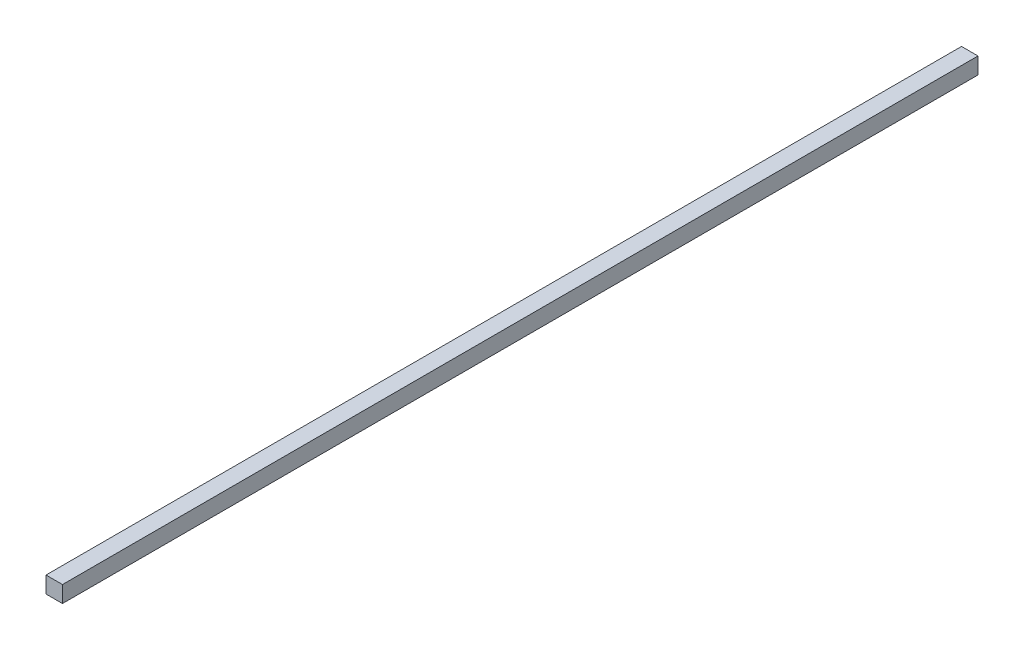
ISO-10303-21;
HEADER;
FILE_DESCRIPTION(('STEP AP214'),'2;1');
FILE_NAME('part.step','',(''),(''),'','','');
FILE_SCHEMA(('AUTOMOTIVE_DESIGN { 1 0 10303 214 1 1 1 1 }'));
ENDSEC;
DATA;
#1=APPLICATION_CONTEXT('core data for automotive mechanical design processes');
#2=APPLICATION_PROTOCOL_DEFINITION('international standard','automotive_design',2000,#1);
#3=PRODUCT_CONTEXT('',#1,'mechanical');
#4=PRODUCT('Part','Part','',(#3));
#5=PRODUCT_RELATED_PRODUCT_CATEGORY('part','',(#4));
#6=PRODUCT_DEFINITION_FORMATION('','',#4);
#7=PRODUCT_DEFINITION_CONTEXT('part definition',#1,'design');
#8=PRODUCT_DEFINITION('design','',#6,#7);
#9=PRODUCT_DEFINITION_SHAPE('','',#8);
#10=(LENGTH_UNIT() NAMED_UNIT(*) SI_UNIT(.MILLI.,.METRE.));
#11=(NAMED_UNIT(*) PLANE_ANGLE_UNIT() SI_UNIT($,.RADIAN.));
#12=(NAMED_UNIT(*) SI_UNIT($,.STERADIAN.) SOLID_ANGLE_UNIT());
#13=UNCERTAINTY_MEASURE_WITH_UNIT(LENGTH_MEASURE(1.E-05),#10,'distance_accuracy_value','');
#14=(GEOMETRIC_REPRESENTATION_CONTEXT(3) GLOBAL_UNCERTAINTY_ASSIGNED_CONTEXT((#13)) GLOBAL_UNIT_ASSIGNED_CONTEXT((#10,
#11,#12)) REPRESENTATION_CONTEXT('',''));
#15=CARTESIAN_POINT('',(0.,0.,0.));
#16=DIRECTION('',(0.,0.,1.));
#17=DIRECTION('',(1.,0.,0.));
#18=AXIS2_PLACEMENT_3D('',#15,#16,#17);
#19=CARTESIAN_POINT('',(9.,9.,1000.));
#20=DIRECTION('',(-1.,0.,0.));
#21=DIRECTION('',(0.,-1.,0.));
#22=AXIS2_PLACEMENT_3D('',#19,#20,#21);
#23=PLANE('',#22);
#24=DIRECTION('',(0.,1.,0.));
#25=VECTOR('',#24,1.);
#26=CARTESIAN_POINT('',(9.,9.,0.));
#27=LINE('',#26,#25);
#28=CARTESIAN_POINT('',(9.,-9.,0.));
#29=VERTEX_POINT('',#28);
#30=CARTESIAN_POINT('',(9.,9.,0.));
#31=VERTEX_POINT('',#30);
#32=EDGE_CURVE('E96',#29,#31,#27,.T.);
#33=ORIENTED_EDGE('',*,*,#32,.T.);
#34=DIRECTION('',(0.,0.,-1.));
#35=VECTOR('',#34,1.);
#36=CARTESIAN_POINT('',(9.,9.,1000.));
#37=LINE('',#36,#35);
#38=CARTESIAN_POINT('',(9.,9.,1000.));
#39=VERTEX_POINT('',#38);
#40=EDGE_CURVE('E11',#39,#31,#37,.T.);
#41=ORIENTED_EDGE('',*,*,#40,.F.);
#42=DIRECTION('',(0.,1.,0.));
#43=VECTOR('',#42,1.);
#44=CARTESIAN_POINT('',(9.,9.,1000.));
#45=LINE('',#44,#43);
#46=CARTESIAN_POINT('',(9.,-9.,1000.));
#47=VERTEX_POINT('',#46);
#48=EDGE_CURVE('E84',#47,#39,#45,.T.);
#49=ORIENTED_EDGE('',*,*,#48,.F.);
#50=DIRECTION('',(0.,0.,-1.));
#51=VECTOR('',#50,1.);
#52=CARTESIAN_POINT('',(9.,-9.,1000.));
#53=LINE('',#52,#51);
#54=EDGE_CURVE('E92',#47,#29,#53,.T.);
#55=ORIENTED_EDGE('',*,*,#54,.T.);
#56=EDGE_LOOP('',(#33,#41,#49,#55));
#57=FACE_BOUND('',#56,.T.);
#58=ADVANCED_FACE('F33',(#57),#23,.F.);
#59=CARTESIAN_POINT('',(-9.,9.,1000.));
#60=DIRECTION('',(0.,-1.,0.));
#61=DIRECTION('',(0.,0.,-1.));
#62=AXIS2_PLACEMENT_3D('',#59,#60,#61);
#63=PLANE('',#62);
#64=DIRECTION('',(-1.,0.,0.));
#65=VECTOR('',#64,1.);
#66=CARTESIAN_POINT('',(-9.,9.,0.));
#67=LINE('',#66,#65);
#68=CARTESIAN_POINT('',(-9.,9.,0.));
#69=VERTEX_POINT('',#68);
#70=EDGE_CURVE('E88',#31,#69,#67,.T.);
#71=ORIENTED_EDGE('',*,*,#70,.T.);
#72=DIRECTION('',(0.,0.,-1.));
#73=VECTOR('',#72,1.);
#74=CARTESIAN_POINT('',(-9.,9.,1000.));
#75=LINE('',#74,#73);
#76=CARTESIAN_POINT('',(-9.,9.,1000.));
#77=VERTEX_POINT('',#76);
#78=EDGE_CURVE('E41',#77,#69,#75,.T.);
#79=ORIENTED_EDGE('',*,*,#78,.F.);
#80=DIRECTION('',(-1.,0.,0.));
#81=VECTOR('',#80,1.);
#82=CARTESIAN_POINT('',(-9.,9.,1000.));
#83=LINE('',#82,#81);
#84=EDGE_CURVE('E79',#39,#77,#83,.T.);
#85=ORIENTED_EDGE('',*,*,#84,.F.);
#86=ORIENTED_EDGE('',*,*,#40,.T.);
#87=EDGE_LOOP('',(#71,#79,#85,#86));
#88=FACE_BOUND('',#87,.T.);
#89=ADVANCED_FACE('F87',(#88),#63,.F.);
#90=CARTESIAN_POINT('',(-9.,9.,1000.));
#91=DIRECTION('',(1.,0.,0.));
#92=DIRECTION('',(0.,0.,-1.));
#93=AXIS2_PLACEMENT_3D('',#90,#91,#92);
#94=PLANE('',#93);
#95=DIRECTION('',(0.,-1.,0.));
#96=VECTOR('',#95,1.);
#97=CARTESIAN_POINT('',(-9.,9.,0.));
#98=LINE('',#97,#96);
#99=CARTESIAN_POINT('',(-9.,-9.,0.));
#100=VERTEX_POINT('',#99);
#101=EDGE_CURVE('E66',#69,#100,#98,.T.);
#102=ORIENTED_EDGE('',*,*,#101,.T.);
#103=DIRECTION('',(0.,0.,-1.));
#104=VECTOR('',#103,1.);
#105=CARTESIAN_POINT('',(-9.,-9.,1000.));
#106=LINE('',#105,#104);
#107=CARTESIAN_POINT('',(-9.,-9.,1000.));
#108=VERTEX_POINT('',#107);
#109=EDGE_CURVE('E89',#108,#100,#106,.T.);
#110=ORIENTED_EDGE('',*,*,#109,.F.);
#111=DIRECTION('',(0.,-1.,0.));
#112=VECTOR('',#111,1.);
#113=CARTESIAN_POINT('',(-9.,9.,1000.));
#114=LINE('',#113,#112);
#115=EDGE_CURVE('E82',#77,#108,#114,.T.);
#116=ORIENTED_EDGE('',*,*,#115,.F.);
#117=ORIENTED_EDGE('',*,*,#78,.T.);
#118=EDGE_LOOP('',(#102,#110,#116,#117));
#119=FACE_BOUND('',#118,.T.);
#120=ADVANCED_FACE('F90',(#119),#94,.F.);
#121=CARTESIAN_POINT('',(-9.,-9.,1000.));
#122=DIRECTION('',(0.,1.,0.));
#123=DIRECTION('',(0.,0.,1.));
#124=AXIS2_PLACEMENT_3D('',#121,#122,#123);
#125=PLANE('',#124);
#126=DIRECTION('',(1.,0.,0.));
#127=VECTOR('',#126,1.);
#128=CARTESIAN_POINT('',(-9.,-9.,0.));
#129=LINE('',#128,#127);
#130=EDGE_CURVE('E72',#100,#29,#129,.T.);
#131=ORIENTED_EDGE('',*,*,#130,.T.);
#132=ORIENTED_EDGE('',*,*,#54,.F.);
#133=DIRECTION('',(1.,0.,0.));
#134=VECTOR('',#133,1.);
#135=CARTESIAN_POINT('',(-9.,-9.,1000.));
#136=LINE('',#135,#134);
#137=EDGE_CURVE('E49',#108,#47,#136,.T.);
#138=ORIENTED_EDGE('',*,*,#137,.F.);
#139=ORIENTED_EDGE('',*,*,#109,.T.);
#140=EDGE_LOOP('',(#131,#132,#138,#139));
#141=FACE_BOUND('',#140,.T.);
#142=ADVANCED_FACE('F103',(#141),#125,.F.);
#143=CARTESIAN_POINT('',(0.,0.,1000.));
#144=DIRECTION('',(0.,0.,1.));
#145=DIRECTION('',(1.,0.,0.));
#146=AXIS2_PLACEMENT_3D('',#143,#144,#145);
#147=PLANE('',#146);
#148=ORIENTED_EDGE('',*,*,#48,.T.);
#149=ORIENTED_EDGE('',*,*,#84,.T.);
#150=ORIENTED_EDGE('',*,*,#115,.T.);
#151=ORIENTED_EDGE('',*,*,#137,.T.);
#152=EDGE_LOOP('',(#148,#149,#150,#151));
#153=FACE_BOUND('',#152,.T.);
#154=ADVANCED_FACE('F80',(#153),#147,.T.);
#155=CARTESIAN_POINT('',(0.,0.,0.));
#156=DIRECTION('',(0.,0.,1.));
#157=DIRECTION('',(1.,0.,0.));
#158=AXIS2_PLACEMENT_3D('',#155,#156,#157);
#159=PLANE('',#158);
#160=ORIENTED_EDGE('',*,*,#32,.F.);
#161=ORIENTED_EDGE('',*,*,#130,.F.);
#162=ORIENTED_EDGE('',*,*,#101,.F.);
#163=ORIENTED_EDGE('',*,*,#70,.F.);
#164=EDGE_LOOP('',(#160,#161,#162,#163));
#165=FACE_BOUND('',#164,.T.);
#166=ADVANCED_FACE('F106',(#165),#159,.F.);
#167=CLOSED_SHELL('',(#58,#89,#120,#142,#154,#166));
#168=MANIFOLD_SOLID_BREP('B2',#167);
#169=ADVANCED_BREP_SHAPE_REPRESENTATION('',(#18,#168),#14);
#170=SHAPE_DEFINITION_REPRESENTATION(#9,#169);
ENDSEC;
END-ISO-10303-21;
